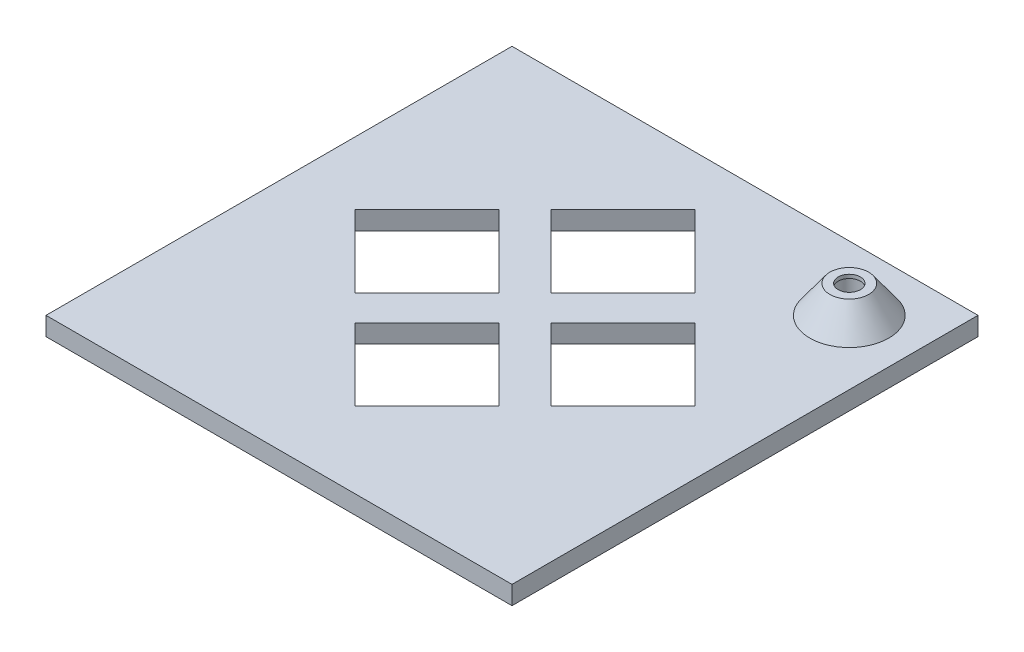
ISO-10303-21;
HEADER;
FILE_DESCRIPTION(('STEP AP214'),'2;1');
FILE_NAME('part.step','',(''),(''),'','','');
FILE_SCHEMA(('AUTOMOTIVE_DESIGN { 1 0 10303 214 1 1 1 1 }'));
ENDSEC;
DATA;
#1=APPLICATION_CONTEXT('core data for automotive mechanical design processes');
#2=APPLICATION_PROTOCOL_DEFINITION('international standard','automotive_design',2000,#1);
#3=PRODUCT_CONTEXT('',#1,'mechanical');
#4=PRODUCT('Part','Part','',(#3));
#5=PRODUCT_RELATED_PRODUCT_CATEGORY('part','',(#4));
#6=PRODUCT_DEFINITION_FORMATION('','',#4);
#7=PRODUCT_DEFINITION_CONTEXT('part definition',#1,'design');
#8=PRODUCT_DEFINITION('design','',#6,#7);
#9=PRODUCT_DEFINITION_SHAPE('','',#8);
#10=(LENGTH_UNIT() NAMED_UNIT(*) SI_UNIT(.MILLI.,.METRE.));
#11=(NAMED_UNIT(*) PLANE_ANGLE_UNIT() SI_UNIT($,.RADIAN.));
#12=(NAMED_UNIT(*) SI_UNIT($,.STERADIAN.) SOLID_ANGLE_UNIT());
#13=UNCERTAINTY_MEASURE_WITH_UNIT(LENGTH_MEASURE(1.E-05),#10,'distance_accuracy_value','');
#14=(GEOMETRIC_REPRESENTATION_CONTEXT(3) GLOBAL_UNCERTAINTY_ASSIGNED_CONTEXT((#13)) GLOBAL_UNIT_ASSIGNED_CONTEXT((#10,
#11,#12)) REPRESENTATION_CONTEXT('',''));
#15=CARTESIAN_POINT('',(0.,0.,0.));
#16=DIRECTION('',(0.,0.,1.));
#17=DIRECTION('',(1.,0.,0.));
#18=AXIS2_PLACEMENT_3D('',#15,#16,#17);
#19=CARTESIAN_POINT('',(0.,5.,0.));
#20=DIRECTION('',(1.,0.,0.));
#21=DIRECTION('',(0.,0.,-1.));
#22=AXIS2_PLACEMENT_3D('',#19,#20,#21);
#23=PLANE('',#22);
#24=DIRECTION('',(0.,0.,1.));
#25=VECTOR('',#24,1.);
#26=CARTESIAN_POINT('',(0.,0.,0.));
#27=LINE('',#26,#25);
#28=CARTESIAN_POINT('',(0.,0.,-126.));
#29=VERTEX_POINT('',#28);
#30=CARTESIAN_POINT('',(0.,0.,0.));
#31=VERTEX_POINT('',#30);
#32=EDGE_CURVE('E384',#29,#31,#27,.T.);
#33=ORIENTED_EDGE('',*,*,#32,.T.);
#34=DIRECTION('',(0.,-1.,0.));
#35=VECTOR('',#34,1.);
#36=CARTESIAN_POINT('',(0.,5.,0.));
#37=LINE('',#36,#35);
#38=CARTESIAN_POINT('',(0.,5.,0.));
#39=VERTEX_POINT('',#38);
#40=EDGE_CURVE('E426',#39,#31,#37,.T.);
#41=ORIENTED_EDGE('',*,*,#40,.F.);
#42=DIRECTION('',(0.,0.,1.));
#43=VECTOR('',#42,1.);
#44=CARTESIAN_POINT('',(0.,5.,0.));
#45=LINE('',#44,#43);
#46=CARTESIAN_POINT('',(0.,5.,-126.));
#47=VERTEX_POINT('',#46);
#48=EDGE_CURVE('E389',#47,#39,#45,.T.);
#49=ORIENTED_EDGE('',*,*,#48,.F.);
#50=DIRECTION('',(0.,-1.,0.));
#51=VECTOR('',#50,1.);
#52=CARTESIAN_POINT('',(0.,5.,-126.));
#53=LINE('',#52,#51);
#54=EDGE_CURVE('E403',#47,#29,#53,.T.);
#55=ORIENTED_EDGE('',*,*,#54,.T.);
#56=EDGE_LOOP('',(#33,#41,#49,#55));
#57=FACE_BOUND('',#56,.T.);
#58=ADVANCED_FACE('F40',(#57),#23,.F.);
#59=CARTESIAN_POINT('',(0.,5.,0.));
#60=DIRECTION('',(0.,0.,-1.));
#61=DIRECTION('',(-1.,0.,0.));
#62=AXIS2_PLACEMENT_3D('',#59,#60,#61);
#63=PLANE('',#62);
#64=DIRECTION('',(1.,0.,0.));
#65=VECTOR('',#64,1.);
#66=CARTESIAN_POINT('',(0.,0.,0.));
#67=LINE('',#66,#65);
#68=CARTESIAN_POINT('',(126.,0.,0.));
#69=VERTEX_POINT('',#68);
#70=EDGE_CURVE('E407',#31,#69,#67,.T.);
#71=ORIENTED_EDGE('',*,*,#70,.T.);
#72=DIRECTION('',(0.,-1.,0.));
#73=VECTOR('',#72,1.);
#74=CARTESIAN_POINT('',(126.,5.,0.));
#75=LINE('',#74,#73);
#76=CARTESIAN_POINT('',(126.,5.,0.));
#77=VERTEX_POINT('',#76);
#78=EDGE_CURVE('E422',#77,#69,#75,.T.);
#79=ORIENTED_EDGE('',*,*,#78,.F.);
#80=DIRECTION('',(1.,0.,0.));
#81=VECTOR('',#80,1.);
#82=CARTESIAN_POINT('',(0.,5.,0.));
#83=LINE('',#82,#81);
#84=EDGE_CURVE('E393',#39,#77,#83,.T.);
#85=ORIENTED_EDGE('',*,*,#84,.F.);
#86=ORIENTED_EDGE('',*,*,#40,.T.);
#87=EDGE_LOOP('',(#71,#79,#85,#86));
#88=FACE_BOUND('',#87,.T.);
#89=ADVANCED_FACE('F455',(#88),#63,.F.);
#90=CARTESIAN_POINT('',(126.,5.,0.));
#91=DIRECTION('',(-1.,0.,0.));
#92=DIRECTION('',(0.,0.,1.));
#93=AXIS2_PLACEMENT_3D('',#90,#91,#92);
#94=PLANE('',#93);
#95=DIRECTION('',(0.,0.,-1.));
#96=VECTOR('',#95,1.);
#97=CARTESIAN_POINT('',(126.,0.,0.));
#98=LINE('',#97,#96);
#99=CARTESIAN_POINT('',(126.,0.,-126.));
#100=VERTEX_POINT('',#99);
#101=EDGE_CURVE('E410',#69,#100,#98,.T.);
#102=ORIENTED_EDGE('',*,*,#101,.T.);
#103=DIRECTION('',(0.,-1.,0.));
#104=VECTOR('',#103,1.);
#105=CARTESIAN_POINT('',(126.,5.,-126.));
#106=LINE('',#105,#104);
#107=CARTESIAN_POINT('',(126.,5.,-126.));
#108=VERTEX_POINT('',#107);
#109=EDGE_CURVE('E418',#108,#100,#106,.T.);
#110=ORIENTED_EDGE('',*,*,#109,.F.);
#111=DIRECTION('',(0.,0.,-1.));
#112=VECTOR('',#111,1.);
#113=CARTESIAN_POINT('',(126.,5.,0.));
#114=LINE('',#113,#112);
#115=EDGE_CURVE('E397',#77,#108,#114,.T.);
#116=ORIENTED_EDGE('',*,*,#115,.F.);
#117=ORIENTED_EDGE('',*,*,#78,.T.);
#118=EDGE_LOOP('',(#102,#110,#116,#117));
#119=FACE_BOUND('',#118,.T.);
#120=ADVANCED_FACE('F460',(#119),#94,.F.);
#121=CARTESIAN_POINT('',(0.,5.,-126.));
#122=DIRECTION('',(0.,0.,1.));
#123=DIRECTION('',(1.,0.,0.));
#124=AXIS2_PLACEMENT_3D('',#121,#122,#123);
#125=PLANE('',#124);
#126=DIRECTION('',(-1.,0.,0.));
#127=VECTOR('',#126,1.);
#128=CARTESIAN_POINT('',(0.,0.,-126.));
#129=LINE('',#128,#127);
#130=EDGE_CURVE('E394',#100,#29,#129,.T.);
#131=ORIENTED_EDGE('',*,*,#130,.T.);
#132=ORIENTED_EDGE('',*,*,#54,.F.);
#133=DIRECTION('',(-1.,0.,0.));
#134=VECTOR('',#133,1.);
#135=CARTESIAN_POINT('',(0.,5.,-126.));
#136=LINE('',#135,#134);
#137=EDGE_CURVE('E400',#108,#47,#136,.T.);
#138=ORIENTED_EDGE('',*,*,#137,.F.);
#139=ORIENTED_EDGE('',*,*,#109,.T.);
#140=EDGE_LOOP('',(#131,#132,#138,#139));
#141=FACE_BOUND('',#140,.T.);
#142=ADVANCED_FACE('F466',(#141),#125,.F.);
#143=CARTESIAN_POINT('',(0.,5.,0.));
#144=DIRECTION('',(0.,-1.,0.));
#145=DIRECTION('',(0.,0.,-1.));
#146=AXIS2_PLACEMENT_3D('',#143,#144,#145);
#147=PLANE('',#146);
#148=DIRECTION('',(-0.707106781186548,0.,-0.707106781186547));
#149=VECTOR('',#148,1.);
#150=CARTESIAN_POINT('',(68.25,5.,-68.2500000000001));
#151=LINE('',#150,#149);
#152=CARTESIAN_POINT('',(63.,5.,-73.5000000000001));
#153=VERTEX_POINT('',#152);
#154=CARTESIAN_POINT('',(43.5,5.,-93.));
#155=VERTEX_POINT('',#154);
#156=EDGE_CURVE('E359',#153,#155,#151,.T.);
#157=ORIENTED_EDGE('',*,*,#156,.T.);
#158=DIRECTION('',(0.707106781186547,0.,-0.707106781186548));
#159=VECTOR('',#158,1.);
#160=CARTESIAN_POINT('',(-24.75,5.,-24.75));
#161=LINE('',#160,#159);
#162=CARTESIAN_POINT('',(63.,5.,-112.5));
#163=VERTEX_POINT('',#162);
#164=EDGE_CURVE('E371',#155,#163,#161,.T.);
#165=ORIENTED_EDGE('',*,*,#164,.T.);
#166=DIRECTION('',(0.707106781186547,0.,0.707106781186548));
#167=VECTOR('',#166,1.);
#168=CARTESIAN_POINT('',(87.7500000000001,5.,-87.7499999999999));
#169=LINE('',#168,#167);
#170=CARTESIAN_POINT('',(82.4999999999999,5.,-93.0000000000001));
#171=VERTEX_POINT('',#170);
#172=EDGE_CURVE('E367',#163,#171,#169,.T.);
#173=ORIENTED_EDGE('',*,*,#172,.T.);
#174=DIRECTION('',(-0.707106781186547,0.,0.707106781186548));
#175=VECTOR('',#174,1.);
#176=CARTESIAN_POINT('',(-5.24999999999998,5.,-5.24999999999997));
#177=LINE('',#176,#175);
#178=EDGE_CURVE('E363',#171,#153,#177,.T.);
#179=ORIENTED_EDGE('',*,*,#178,.T.);
#180=EDGE_LOOP('',(#157,#165,#173,#179));
#181=FACE_BOUND('',#180,.T.);
#182=DIRECTION('',(0.707106781186548,0.,0.707106781186548));
#183=VECTOR('',#182,1.);
#184=CARTESIAN_POINT('',(87.75,5.,-87.75));
#185=LINE('',#184,#183);
#186=CARTESIAN_POINT('',(89.5,5.,-86.0000000000001));
#187=VERTEX_POINT('',#186);
#188=CARTESIAN_POINT('',(109.,5.,-66.5000000000001));
#189=VERTEX_POINT('',#188);
#190=EDGE_CURVE('E343',#187,#189,#185,.T.);
#191=ORIENTED_EDGE('',*,*,#190,.T.);
#192=DIRECTION('',(-0.707106781186548,0.,0.707106781186547));
#193=VECTOR('',#192,1.);
#194=CARTESIAN_POINT('',(21.2499999999999,5.,21.2499999999999));
#195=LINE('',#194,#193);
#196=CARTESIAN_POINT('',(89.5,5.,-47.));
#197=VERTEX_POINT('',#196);
#198=EDGE_CURVE('E355',#189,#197,#195,.T.);
#199=ORIENTED_EDGE('',*,*,#198,.T.);
#200=DIRECTION('',(-0.707106781186547,0.,-0.707106781186548));
#201=VECTOR('',#200,1.);
#202=CARTESIAN_POINT('',(68.25,5.,-68.25));
#203=LINE('',#202,#201);
#204=CARTESIAN_POINT('',(70.,5.,-66.5000000000001));
#205=VERTEX_POINT('',#204);
#206=EDGE_CURVE('E351',#197,#205,#203,.T.);
#207=ORIENTED_EDGE('',*,*,#206,.T.);
#208=DIRECTION('',(0.707106781186548,0.,-0.707106781186548));
#209=VECTOR('',#208,1.);
#210=CARTESIAN_POINT('',(1.74999999999996,5.,1.74999999999996));
#211=LINE('',#210,#209);
#212=EDGE_CURVE('E347',#205,#187,#211,.T.);
#213=ORIENTED_EDGE('',*,*,#212,.T.);
#214=EDGE_LOOP('',(#191,#199,#207,#213));
#215=FACE_BOUND('',#214,.T.);
#216=DIRECTION('',(0.707106781186548,0.,0.707106781186547));
#217=VECTOR('',#216,1.);
#218=CARTESIAN_POINT('',(61.25,5.,-61.25));
#219=LINE('',#218,#217);
#220=CARTESIAN_POINT('',(36.4999999999999,5.,-86.0000000000001));
#221=VERTEX_POINT('',#220);
#222=CARTESIAN_POINT('',(55.9999999999999,5.,-66.5000000000001));
#223=VERTEX_POINT('',#222);
#224=EDGE_CURVE('E330',#221,#223,#219,.T.);
#225=ORIENTED_EDGE('',*,*,#224,.T.);
#226=DIRECTION('',(-0.707106781186547,0.,0.707106781186548));
#227=VECTOR('',#226,1.);
#228=CARTESIAN_POINT('',(-5.25000000000003,5.,-5.25000000000002));
#229=LINE('',#228,#227);
#230=CARTESIAN_POINT('',(36.5,5.,-47.0000000000001));
#231=VERTEX_POINT('',#230);
#232=EDGE_CURVE('E187',#223,#231,#229,.T.);
#233=ORIENTED_EDGE('',*,*,#232,.T.);
#234=DIRECTION('',(-0.707106781186548,0.,-0.707106781186547));
#235=VECTOR('',#234,1.);
#236=CARTESIAN_POINT('',(41.75,5.,-41.75));
#237=LINE('',#236,#235);
#238=CARTESIAN_POINT('',(16.9999999999999,5.,-66.5));
#239=VERTEX_POINT('',#238);
#240=EDGE_CURVE('E337',#231,#239,#237,.T.);
#241=ORIENTED_EDGE('',*,*,#240,.T.);
#242=DIRECTION('',(0.707106781186547,0.,-0.707106781186548));
#243=VECTOR('',#242,1.);
#244=CARTESIAN_POINT('',(-24.75,5.,-24.75));
#245=LINE('',#244,#243);
#246=EDGE_CURVE('E333',#239,#221,#245,.T.);
#247=ORIENTED_EDGE('',*,*,#246,.T.);
#248=EDGE_LOOP('',(#225,#233,#241,#247));
#249=FACE_BOUND('',#248,.T.);
#250=DIRECTION('',(0.707106781186548,0.,-0.707106781186548));
#251=VECTOR('',#250,1.);
#252=CARTESIAN_POINT('',(1.74999999999996,5.,1.74999999999996));
#253=LINE('',#252,#251);
#254=CARTESIAN_POINT('',(43.5,5.,-40.));
#255=VERTEX_POINT('',#254);
#256=CARTESIAN_POINT('',(63.,5.,-59.5));
#257=VERTEX_POINT('',#256);
#258=EDGE_CURVE('E304',#255,#257,#253,.T.);
#259=ORIENTED_EDGE('',*,*,#258,.T.);
#260=DIRECTION('',(0.707106781186548,0.,0.707106781186548));
#261=VECTOR('',#260,1.);
#262=CARTESIAN_POINT('',(61.25,5.,-61.25));
#263=LINE('',#262,#261);
#264=CARTESIAN_POINT('',(82.5,5.,-40.));
#265=VERTEX_POINT('',#264);
#266=EDGE_CURVE('E326',#257,#265,#263,.T.);
#267=ORIENTED_EDGE('',*,*,#266,.T.);
#268=DIRECTION('',(-0.707106781186548,0.,0.707106781186547));
#269=VECTOR('',#268,1.);
#270=CARTESIAN_POINT('',(21.25,5.,21.25));
#271=LINE('',#270,#269);
#272=CARTESIAN_POINT('',(63.,5.,-20.5));
#273=VERTEX_POINT('',#272);
#274=EDGE_CURVE('E322',#265,#273,#271,.T.);
#275=ORIENTED_EDGE('',*,*,#274,.T.);
#276=DIRECTION('',(-0.707106781186548,0.,-0.707106781186547));
#277=VECTOR('',#276,1.);
#278=CARTESIAN_POINT('',(41.75,5.,-41.75));
#279=LINE('',#278,#277);
#280=EDGE_CURVE('E318',#273,#255,#279,.T.);
#281=ORIENTED_EDGE('',*,*,#280,.T.);
#282=EDGE_LOOP('',(#259,#267,#275,#281));
#283=FACE_BOUND('',#282,.T.);
#284=CARTESIAN_POINT('',(108.6,5.,-108.6));
#285=DIRECTION('',(0.,-1.,0.));
#286=DIRECTION('',(0.,0.,-1.));
#287=AXIS2_PLACEMENT_3D('',#284,#285,#286);
#288=CIRCLE('',#287,10.6836436799865);
#289=CARTESIAN_POINT('',(108.6,5.,-119.283643679987));
#290=VERTEX_POINT('',#289);
#291=EDGE_CURVE('E11',#290,#290,#288,.T.);
#292=ORIENTED_EDGE('',*,*,#291,.T.);
#293=EDGE_LOOP('',(#292));
#294=FACE_BOUND('',#293,.T.);
#295=ORIENTED_EDGE('',*,*,#48,.T.);
#296=ORIENTED_EDGE('',*,*,#84,.T.);
#297=ORIENTED_EDGE('',*,*,#115,.T.);
#298=ORIENTED_EDGE('',*,*,#137,.T.);
#299=EDGE_LOOP('',(#295,#296,#297,#298));
#300=FACE_BOUND('',#299,.T.);
#301=ADVANCED_FACE('F470',(#181,#215,#249,#283,#294,#300),#147,.F.);
#302=CARTESIAN_POINT('',(0.,0.,0.));
#303=DIRECTION('',(0.,-1.,0.));
#304=DIRECTION('',(0.,0.,-1.));
#305=AXIS2_PLACEMENT_3D('',#302,#303,#304);
#306=PLANE('',#305);
#307=DIRECTION('',(-0.707106781186547,0.,0.707106781186548));
#308=VECTOR('',#307,1.);
#309=CARTESIAN_POINT('',(43.5,0.,-93.));
#310=LINE('',#309,#308);
#311=CARTESIAN_POINT('',(63.,0.,-112.5));
#312=VERTEX_POINT('',#311);
#313=CARTESIAN_POINT('',(43.5,0.,-93.));
#314=VERTEX_POINT('',#313);
#315=EDGE_CURVE('E217',#312,#314,#310,.T.);
#316=ORIENTED_EDGE('',*,*,#315,.T.);
#317=DIRECTION('',(0.707106781186548,0.,0.707106781186547));
#318=VECTOR('',#317,1.);
#319=CARTESIAN_POINT('',(63.,0.,-73.5000000000001));
#320=LINE('',#319,#318);
#321=CARTESIAN_POINT('',(63.,0.,-73.5000000000001));
#322=VERTEX_POINT('',#321);
#323=EDGE_CURVE('E227',#314,#322,#320,.T.);
#324=ORIENTED_EDGE('',*,*,#323,.T.);
#325=DIRECTION('',(0.707106781186547,0.,-0.707106781186548));
#326=VECTOR('',#325,1.);
#327=CARTESIAN_POINT('',(63.,0.,-73.5000000000001));
#328=LINE('',#327,#326);
#329=CARTESIAN_POINT('',(82.4999999999999,0.,-93.0000000000001));
#330=VERTEX_POINT('',#329);
#331=EDGE_CURVE('E231',#322,#330,#328,.T.);
#332=ORIENTED_EDGE('',*,*,#331,.T.);
#333=DIRECTION('',(-0.707106781186547,0.,-0.707106781186548));
#334=VECTOR('',#333,1.);
#335=CARTESIAN_POINT('',(82.4999999999999,0.,-93.0000000000001));
#336=LINE('',#335,#334);
#337=EDGE_CURVE('E235',#330,#312,#336,.T.);
#338=ORIENTED_EDGE('',*,*,#337,.T.);
#339=EDGE_LOOP('',(#316,#324,#332,#338));
#340=FACE_BOUND('',#339,.T.);
#341=DIRECTION('',(0.707106781186548,0.,-0.707106781186547));
#342=VECTOR('',#341,1.);
#343=CARTESIAN_POINT('',(89.5,0.,-47.));
#344=LINE('',#343,#342);
#345=CARTESIAN_POINT('',(89.5,0.,-47.));
#346=VERTEX_POINT('',#345);
#347=CARTESIAN_POINT('',(109.,0.,-66.5000000000001));
#348=VERTEX_POINT('',#347);
#349=EDGE_CURVE('E243',#346,#348,#344,.T.);
#350=ORIENTED_EDGE('',*,*,#349,.T.);
#351=DIRECTION('',(-0.707106781186548,0.,-0.707106781186548));
#352=VECTOR('',#351,1.);
#353=CARTESIAN_POINT('',(89.5,0.,-86.0000000000001));
#354=LINE('',#353,#352);
#355=CARTESIAN_POINT('',(89.5,0.,-86.0000000000001));
#356=VERTEX_POINT('',#355);
#357=EDGE_CURVE('E257',#348,#356,#354,.T.);
#358=ORIENTED_EDGE('',*,*,#357,.T.);
#359=DIRECTION('',(-0.707106781186548,0.,0.707106781186548));
#360=VECTOR('',#359,1.);
#361=CARTESIAN_POINT('',(70.,0.,-66.5000000000001));
#362=LINE('',#361,#360);
#363=CARTESIAN_POINT('',(70.,0.,-66.5000000000001));
#364=VERTEX_POINT('',#363);
#365=EDGE_CURVE('E261',#356,#364,#362,.T.);
#366=ORIENTED_EDGE('',*,*,#365,.T.);
#367=DIRECTION('',(0.707106781186547,0.,0.707106781186548));
#368=VECTOR('',#367,1.);
#369=CARTESIAN_POINT('',(70.,0.,-66.5000000000001));
#370=LINE('',#369,#368);
#371=EDGE_CURVE('E265',#364,#346,#370,.T.);
#372=ORIENTED_EDGE('',*,*,#371,.T.);
#373=EDGE_LOOP('',(#350,#358,#366,#372));
#374=FACE_BOUND('',#373,.T.);
#375=DIRECTION('',(0.707106781186547,0.,-0.707106781186548));
#376=VECTOR('',#375,1.);
#377=CARTESIAN_POINT('',(55.9999999999999,0.,-66.5000000000001));
#378=LINE('',#377,#376);
#379=CARTESIAN_POINT('',(36.5,0.,-47.0000000000001));
#380=VERTEX_POINT('',#379);
#381=CARTESIAN_POINT('',(55.9999999999999,0.,-66.5000000000001));
#382=VERTEX_POINT('',#381);
#383=EDGE_CURVE('E184',#380,#382,#378,.T.);
#384=ORIENTED_EDGE('',*,*,#383,.T.);
#385=DIRECTION('',(-0.707106781186548,0.,-0.707106781186547));
#386=VECTOR('',#385,1.);
#387=CARTESIAN_POINT('',(55.9999999999999,0.,-66.5000000000001));
#388=LINE('',#387,#386);
#389=CARTESIAN_POINT('',(36.4999999999999,0.,-86.));
#390=VERTEX_POINT('',#389);
#391=EDGE_CURVE('E196',#382,#390,#388,.T.);
#392=ORIENTED_EDGE('',*,*,#391,.T.);
#393=DIRECTION('',(-0.707106781186547,0.,0.707106781186548));
#394=VECTOR('',#393,1.);
#395=CARTESIAN_POINT('',(36.4999999999999,0.,-86.0000000000001));
#396=LINE('',#395,#394);
#397=CARTESIAN_POINT('',(16.9999999999999,0.,-66.5));
#398=VERTEX_POINT('',#397);
#399=EDGE_CURVE('E202',#390,#398,#396,.T.);
#400=ORIENTED_EDGE('',*,*,#399,.T.);
#401=DIRECTION('',(0.707106781186548,0.,0.707106781186547));
#402=VECTOR('',#401,1.);
#403=CARTESIAN_POINT('',(36.5,0.,-47.0000000000001));
#404=LINE('',#403,#402);
#405=EDGE_CURVE('E192',#398,#380,#404,.T.);
#406=ORIENTED_EDGE('',*,*,#405,.T.);
#407=EDGE_LOOP('',(#384,#392,#400,#406));
#408=FACE_BOUND('',#407,.T.);
#409=DIRECTION('',(-0.707106781186548,0.,-0.707106781186548));
#410=VECTOR('',#409,1.);
#411=CARTESIAN_POINT('',(63.,0.,-59.5));
#412=LINE('',#411,#410);
#413=CARTESIAN_POINT('',(82.5,0.,-40.));
#414=VERTEX_POINT('',#413);
#415=CARTESIAN_POINT('',(63.,0.,-59.5));
#416=VERTEX_POINT('',#415);
#417=EDGE_CURVE('E273',#414,#416,#412,.T.);
#418=ORIENTED_EDGE('',*,*,#417,.T.);
#419=DIRECTION('',(-0.707106781186548,0.,0.707106781186548));
#420=VECTOR('',#419,1.);
#421=CARTESIAN_POINT('',(63.,0.,-59.5));
#422=LINE('',#421,#420);
#423=CARTESIAN_POINT('',(43.5,0.,-40.));
#424=VERTEX_POINT('',#423);
#425=EDGE_CURVE('E287',#416,#424,#422,.T.);
#426=ORIENTED_EDGE('',*,*,#425,.T.);
#427=DIRECTION('',(0.707106781186548,0.,0.707106781186547));
#428=VECTOR('',#427,1.);
#429=CARTESIAN_POINT('',(43.5,0.,-40.));
#430=LINE('',#429,#428);
#431=CARTESIAN_POINT('',(63.,0.,-20.5));
#432=VERTEX_POINT('',#431);
#433=EDGE_CURVE('E291',#424,#432,#430,.T.);
#434=ORIENTED_EDGE('',*,*,#433,.T.);
#435=DIRECTION('',(0.707106781186548,0.,-0.707106781186547));
#436=VECTOR('',#435,1.);
#437=CARTESIAN_POINT('',(82.5,0.,-40.));
#438=LINE('',#437,#436);
#439=EDGE_CURVE('E295',#432,#414,#438,.T.);
#440=ORIENTED_EDGE('',*,*,#439,.T.);
#441=EDGE_LOOP('',(#418,#426,#434,#440));
#442=FACE_BOUND('',#441,.T.);
#443=CARTESIAN_POINT('',(108.6,0.,-108.6));
#444=DIRECTION('',(0.,-1.,0.));
#445=DIRECTION('',(0.,0.,-1.));
#446=AXIS2_PLACEMENT_3D('',#443,#444,#445);
#447=CIRCLE('',#446,3.44999999999999);
#448=CARTESIAN_POINT('',(108.6,0.,-112.05));
#449=VERTEX_POINT('',#448);
#450=EDGE_CURVE('E385',#449,#449,#447,.T.);
#451=ORIENTED_EDGE('',*,*,#450,.F.);
#452=EDGE_LOOP('',(#451));
#453=FACE_BOUND('',#452,.T.);
#454=ORIENTED_EDGE('',*,*,#32,.F.);
#455=ORIENTED_EDGE('',*,*,#130,.F.);
#456=ORIENTED_EDGE('',*,*,#101,.F.);
#457=ORIENTED_EDGE('',*,*,#70,.F.);
#458=EDGE_LOOP('',(#454,#455,#456,#457));
#459=FACE_BOUND('',#458,.T.);
#460=ADVANCED_FACE('F204',(#340,#374,#408,#442,#453,#459),#306,.T.);
#461=CARTESIAN_POINT('',(108.6,12.5,-108.6));
#462=DIRECTION('',(0.,1.,0.));
#463=DIRECTION('',(0.,0.,1.));
#464=AXIS2_PLACEMENT_3D('',#461,#462,#463);
#465=PLANE('',#464);
#466=CARTESIAN_POINT('',(108.6,12.5,-108.6));
#467=DIRECTION('',(0.,1.,0.));
#468=DIRECTION('',(0.,0.,1.));
#469=AXIS2_PLACEMENT_3D('',#466,#467,#468);
#470=CIRCLE('',#469,5.23457471994626);
#471=CARTESIAN_POINT('',(108.6,12.5,-113.834574719946));
#472=VERTEX_POINT('',#471);
#473=EDGE_CURVE('E50',#472,#472,#470,.T.);
#474=ORIENTED_EDGE('',*,*,#473,.T.);
#475=EDGE_LOOP('',(#474));
#476=FACE_BOUND('',#475,.T.);
#477=CARTESIAN_POINT('',(108.6,12.5,-108.6));
#478=DIRECTION('',(0.,1.,0.));
#479=DIRECTION('',(0.,0.,1.));
#480=AXIS2_PLACEMENT_3D('',#477,#478,#479);
#481=CIRCLE('',#480,3.00000000000001);
#482=CARTESIAN_POINT('',(108.6,12.5,-105.6));
#483=VERTEX_POINT('',#482);
#484=EDGE_CURVE('E375',#483,#483,#481,.T.);
#485=ORIENTED_EDGE('',*,*,#484,.F.);
#486=EDGE_LOOP('',(#485));
#487=FACE_BOUND('',#486,.T.);
#488=ADVANCED_FACE('F436',(#476,#487),#465,.T.);
#489=CARTESIAN_POINT('',(108.6,11.5,-108.6));
#490=DIRECTION('',(0.,-1.,0.));
#491=DIRECTION('',(0.,0.,-1.));
#492=AXIS2_PLACEMENT_3D('',#489,#490,#491);
#493=CYLINDRICAL_SURFACE('',#492,3.44999999999999);
#494=CARTESIAN_POINT('',(108.6,11.5,-108.6));
#495=DIRECTION('',(0.,-1.,0.));
#496=DIRECTION('',(0.,0.,-1.));
#497=AXIS2_PLACEMENT_3D('',#494,#495,#496);
#498=CIRCLE('',#497,3.44999999999999);
#499=CARTESIAN_POINT('',(108.6,11.5,-112.05));
#500=VERTEX_POINT('',#499);
#501=EDGE_CURVE('E380',#500,#500,#498,.T.);
#502=ORIENTED_EDGE('',*,*,#501,.F.);
#503=EDGE_LOOP('',(#502));
#504=FACE_BOUND('',#503,.T.);
#505=ORIENTED_EDGE('',*,*,#450,.T.);
#506=EDGE_LOOP('',(#505));
#507=FACE_BOUND('',#506,.T.);
#508=ADVANCED_FACE('F480',(#504,#507),#493,.F.);
#509=CARTESIAN_POINT('',(108.6,11.5,-108.6));
#510=DIRECTION('',(0.,-1.,0.));
#511=DIRECTION('',(0.,0.,-1.));
#512=AXIS2_PLACEMENT_3D('',#509,#510,#511);
#513=PLANE('',#512);
#514=CARTESIAN_POINT('',(108.6,11.5,-108.6));
#515=DIRECTION('',(0.,-1.,0.));
#516=DIRECTION('',(0.,0.,-1.));
#517=AXIS2_PLACEMENT_3D('',#514,#515,#516);
#518=CIRCLE('',#517,3.00000000000001);
#519=CARTESIAN_POINT('',(108.6,11.5,-111.6));
#520=VERTEX_POINT('',#519);
#521=EDGE_CURVE('E379',#520,#520,#518,.T.);
#522=ORIENTED_EDGE('',*,*,#521,.F.);
#523=EDGE_LOOP('',(#522));
#524=FACE_BOUND('',#523,.T.);
#525=ORIENTED_EDGE('',*,*,#501,.T.);
#526=EDGE_LOOP('',(#525));
#527=FACE_BOUND('',#526,.T.);
#528=ADVANCED_FACE('F450',(#524,#527),#513,.T.);
#529=CARTESIAN_POINT('',(108.6,0.,-108.6));
#530=DIRECTION('',(0.,1.,0.));
#531=DIRECTION('',(0.,0.,1.));
#532=AXIS2_PLACEMENT_3D('',#529,#530,#531);
#533=CYLINDRICAL_SURFACE('',#532,3.00000000000001);
#534=ORIENTED_EDGE('',*,*,#521,.T.);
#535=EDGE_LOOP('',(#534));
#536=FACE_BOUND('',#535,.T.);
#537=ORIENTED_EDGE('',*,*,#484,.T.);
#538=EDGE_LOOP('',(#537));
#539=FACE_BOUND('',#538,.T.);
#540=ADVANCED_FACE('F441',(#536,#539),#533,.F.);
#541=CARTESIAN_POINT('',(108.6,12.5,-108.6));
#542=DIRECTION('',(0.,-1.,0.));
#543=DIRECTION('',(0.,0.,-1.));
#544=AXIS2_PLACEMENT_3D('',#541,#542,#543);
#545=CONICAL_SURFACE('',#544,5.23457471994626,0.628318530717965);
#546=CARTESIAN_POINT('',(108.6,5.,-119.283643679987));
#547=CARTESIAN_POINT('',(108.6,5.078125,-119.226882544986));
#548=CARTESIAN_POINT('',(108.6,5.15625,-119.170121409986));
#549=CARTESIAN_POINT('',(108.6,5.3125,-119.056599139985));
#550=CARTESIAN_POINT('',(108.6,5.390625,-118.999838004984));
#551=CARTESIAN_POINT('',(108.6,5.546875,-118.886315734984));
#552=CARTESIAN_POINT('',(108.6,5.625,-118.829554599983));
#553=CARTESIAN_POINT('',(108.6,5.78125,-118.716032329982));
#554=CARTESIAN_POINT('',(108.6,5.859375,-118.659271194982));
#555=CARTESIAN_POINT('',(108.6,6.015625,-118.545748924981));
#556=CARTESIAN_POINT('',(108.6,6.09375,-118.488987789981));
#557=CARTESIAN_POINT('',(108.6,6.25,-118.37546551998));
#558=CARTESIAN_POINT('',(108.6,6.328125,-118.318704384979));
#559=CARTESIAN_POINT('',(108.6,6.484375,-118.205182114979));
#560=CARTESIAN_POINT('',(108.6,6.5625,-118.148420979978));
#561=CARTESIAN_POINT('',(108.6,6.71875,-118.034898709977));
#562=CARTESIAN_POINT('',(108.6,6.796875,-117.978137574977));
#563=CARTESIAN_POINT('',(108.6,6.953125,-117.864615304976));
#564=CARTESIAN_POINT('',(108.6,7.03125,-117.807854169976));
#565=CARTESIAN_POINT('',(108.6,7.1875,-117.694331899975));
#566=CARTESIAN_POINT('',(108.6,7.265625,-117.637570764974));
#567=CARTESIAN_POINT('',(108.6,7.421875,-117.524048494974));
#568=CARTESIAN_POINT('',(108.6,7.5,-117.467287359973));
#569=CARTESIAN_POINT('',(108.6,7.65625,-117.353765089972));
#570=CARTESIAN_POINT('',(108.6,7.734375,-117.297003954972));
#571=CARTESIAN_POINT('',(108.6,7.890625,-117.183481684971));
#572=CARTESIAN_POINT('',(108.6,7.96875,-117.126720549971));
#573=CARTESIAN_POINT('',(108.6,8.125,-117.01319827997));
#574=CARTESIAN_POINT('',(108.6,8.203125,-116.956437144969));
#575=CARTESIAN_POINT('',(108.6,8.359375,-116.842914874968));
#576=CARTESIAN_POINT('',(108.6,8.4375,-116.786153739968));
#577=CARTESIAN_POINT('',(108.6,8.59375,-116.672631469967));
#578=CARTESIAN_POINT('',(108.6,8.671875,-116.615870334967));
#579=CARTESIAN_POINT('',(108.6,8.828125,-116.502348064966));
#580=CARTESIAN_POINT('',(108.6,8.90625,-116.445586929966));
#581=CARTESIAN_POINT('',(108.6,9.0625,-116.332064659965));
#582=CARTESIAN_POINT('',(108.6,9.140625,-116.275303524964));
#583=CARTESIAN_POINT('',(108.6,9.296875,-116.161781254963));
#584=CARTESIAN_POINT('',(108.6,9.375,-116.105020119963));
#585=CARTESIAN_POINT('',(108.6,9.53125,-115.991497849962));
#586=CARTESIAN_POINT('',(108.6,9.609375,-115.934736714962));
#587=CARTESIAN_POINT('',(108.6,9.765625,-115.821214444961));
#588=CARTESIAN_POINT('',(108.6,9.84375,-115.764453309961));
#589=CARTESIAN_POINT('',(108.6,10.,-115.65093103996));
#590=CARTESIAN_POINT('',(108.6,10.078125,-115.594169904959));
#591=CARTESIAN_POINT('',(108.6,10.234375,-115.480647634958));
#592=CARTESIAN_POINT('',(108.6,10.3125,-115.423886499958));
#593=CARTESIAN_POINT('',(108.6,10.46875,-115.310364229957));
#594=CARTESIAN_POINT('',(108.6,10.546875,-115.253603094957));
#595=CARTESIAN_POINT('',(108.6,10.703125,-115.140080824956));
#596=CARTESIAN_POINT('',(108.6,10.78125,-115.083319689955));
#597=CARTESIAN_POINT('',(108.6,10.9375,-114.969797419955));
#598=CARTESIAN_POINT('',(108.6,11.015625,-114.913036284954));
#599=CARTESIAN_POINT('',(108.6,11.171875,-114.799514014953));
#600=CARTESIAN_POINT('',(108.6,11.25,-114.742752879953));
#601=CARTESIAN_POINT('',(108.6,11.40625,-114.629230609952));
#602=CARTESIAN_POINT('',(108.6,11.484375,-114.572469474952));
#603=CARTESIAN_POINT('',(108.6,11.640625,-114.458947204951));
#604=CARTESIAN_POINT('',(108.6,11.71875,-114.40218606995));
#605=CARTESIAN_POINT('',(108.6,11.875,-114.28866379995));
#606=CARTESIAN_POINT('',(108.6,11.953125,-114.231902664949));
#607=CARTESIAN_POINT('',(108.6,12.109375,-114.118380394948));
#608=CARTESIAN_POINT('',(108.6,12.1875,-114.061619259948));
#609=CARTESIAN_POINT('',(108.6,12.34375,-113.948096989947));
#610=CARTESIAN_POINT('',(108.6,12.421875,-113.891335854947));
#611=CARTESIAN_POINT('',(108.6,12.5,-113.834574719946));
#612=B_SPLINE_CURVE_WITH_KNOTS('',3,(#546,#547,#548,#549,#550,#551,#552,#553,#554,#555,#556,
#557,#558,#559,#560,#561,#562,#563,#564,#565,#566,#567,#568,#569,#570,#571,#572,#573,#574,#575,
#576,#577,#578,#579,#580,#581,#582,#583,#584,#585,#586,#587,#588,#589,#590,#591,#592,#593,#594,
#595,#596,#597,#598,#599,#600,#601,#602,#603,#604,#605,#606,#607,#608,#609,#610,#611),
.UNSPECIFIED.,.F.,.F.,(4,2,2,2,2,2,2,2,2,2,2,2,2,2,2,2,2,2,2,2,2,2,2,2,2,2,2,2,2,2,2,2,4),(0.,
0.289703432226508,0.579406864453025,0.869110296679541,1.15881372890605,1.44851716113257,
1.73822059335908,2.0279240255856,2.31762745781211,2.60733089003862,2.89703432226514,
3.18673775449166,3.47644118671817,3.76614461894468,4.0558480511712,4.34555148339771,
4.63525491562423,4.92495834785074,5.21466178007725,5.50436521230377,5.79406864453029,
6.0837720767568,6.37347550898331,6.66317894120983,6.95288237343634,7.24258580566286,
7.53228923788937,7.82199267011588,8.1116961023424,8.40139953456892,8.69110296679543,
8.98080639902195,9.27050983124846),.UNSPECIFIED.);
#613=EDGE_CURVE('BSEAM43',#290,#472,#612,.T.);
#614=ORIENTED_EDGE('',*,*,#291,.F.);
#615=ORIENTED_EDGE('',*,*,#473,.F.);
#616=ORIENTED_EDGE('',*,*,#613,.T.);
#617=ORIENTED_EDGE('',*,*,#613,.F.);
#618=EDGE_LOOP('',(#614,#616,#615,#617));
#619=FACE_BOUND('',#618,.T.);
#620=ADVANCED_FACE('F43',(#619),#545,.T.);
#621=CARTESIAN_POINT('',(63.,0.,-59.5));
#622=DIRECTION('',(0.707106781186548,0.,-0.707106781186548));
#623=DIRECTION('',(-0.707106781186548,0.,-0.707106781186548));
#624=AXIS2_PLACEMENT_3D('',#621,#622,#623);
#625=PLANE('',#624);
#626=DIRECTION('',(0.,1.,0.));
#627=VECTOR('',#626,1.);
#628=CARTESIAN_POINT('',(63.,0.,-59.5));
#629=LINE('',#628,#627);
#630=EDGE_CURVE('E299',#416,#257,#629,.T.);
#631=ORIENTED_EDGE('',*,*,#630,.F.);
#632=ORIENTED_EDGE('',*,*,#417,.F.);
#633=DIRECTION('',(0.,1.,0.));
#634=VECTOR('',#633,1.);
#635=CARTESIAN_POINT('',(82.5,0.,-40.));
#636=LINE('',#635,#634);
#637=EDGE_CURVE('E300',#414,#265,#636,.T.);
#638=ORIENTED_EDGE('',*,*,#637,.T.);
#639=ORIENTED_EDGE('',*,*,#266,.F.);
#640=EDGE_LOOP('',(#631,#632,#638,#639));
#641=FACE_BOUND('',#640,.T.);
#642=ADVANCED_FACE('F440',(#641),#625,.F.);
#643=CARTESIAN_POINT('',(82.5,0.,-40.));
#644=DIRECTION('',(0.707106781186547,0.,0.707106781186548));
#645=DIRECTION('',(0.707106781186548,0.,-0.707106781186547));
#646=AXIS2_PLACEMENT_3D('',#643,#644,#645);
#647=PLANE('',#646);
#648=ORIENTED_EDGE('',*,*,#637,.F.);
#649=ORIENTED_EDGE('',*,*,#439,.F.);
#650=DIRECTION('',(0.,1.,0.));
#651=VECTOR('',#650,1.);
#652=CARTESIAN_POINT('',(63.,0.,-20.5));
#653=LINE('',#652,#651);
#654=EDGE_CURVE('E305',#432,#273,#653,.T.);
#655=ORIENTED_EDGE('',*,*,#654,.T.);
#656=ORIENTED_EDGE('',*,*,#274,.F.);
#657=EDGE_LOOP('',(#648,#649,#655,#656));
#658=FACE_BOUND('',#657,.T.);
#659=ADVANCED_FACE('F447',(#658),#647,.F.);
#660=CARTESIAN_POINT('',(43.5,0.,-40.));
#661=DIRECTION('',(-0.707106781186547,0.,0.707106781186548));
#662=DIRECTION('',(0.707106781186548,0.,0.707106781186547));
#663=AXIS2_PLACEMENT_3D('',#660,#661,#662);
#664=PLANE('',#663);
#665=ORIENTED_EDGE('',*,*,#654,.F.);
#666=ORIENTED_EDGE('',*,*,#433,.F.);
#667=DIRECTION('',(0.,1.,0.));
#668=VECTOR('',#667,1.);
#669=CARTESIAN_POINT('',(43.5,0.,-40.));
#670=LINE('',#669,#668);
#671=EDGE_CURVE('E309',#424,#255,#670,.T.);
#672=ORIENTED_EDGE('',*,*,#671,.T.);
#673=ORIENTED_EDGE('',*,*,#280,.F.);
#674=EDGE_LOOP('',(#665,#666,#672,#673));
#675=FACE_BOUND('',#674,.T.);
#676=ADVANCED_FACE('F490',(#675),#664,.F.);
#677=CARTESIAN_POINT('',(63.,0.,-59.5));
#678=DIRECTION('',(-0.707106781186548,0.,-0.707106781186548));
#679=DIRECTION('',(-0.707106781186548,0.,0.707106781186548));
#680=AXIS2_PLACEMENT_3D('',#677,#678,#679);
#681=PLANE('',#680);
#682=ORIENTED_EDGE('',*,*,#671,.F.);
#683=ORIENTED_EDGE('',*,*,#425,.F.);
#684=ORIENTED_EDGE('',*,*,#630,.T.);
#685=ORIENTED_EDGE('',*,*,#258,.F.);
#686=EDGE_LOOP('',(#682,#683,#684,#685));
#687=FACE_BOUND('',#686,.T.);
#688=ADVANCED_FACE('F487',(#687),#681,.F.);
#689=CARTESIAN_POINT('',(55.9999999999999,0.,-66.5000000000001));
#690=DIRECTION('',(0.707106781186548,0.,0.707106781186547));
#691=DIRECTION('',(0.707106781186547,0.,-0.707106781186548));
#692=AXIS2_PLACEMENT_3D('',#689,#690,#691);
#693=PLANE('',#692);
#694=DIRECTION('',(0.,1.,0.));
#695=VECTOR('',#694,1.);
#696=CARTESIAN_POINT('',(55.9999999999999,0.,-66.5000000000001));
#697=LINE('',#696,#695);
#698=EDGE_CURVE('E179',#382,#223,#697,.T.);
#699=ORIENTED_EDGE('',*,*,#698,.F.);
#700=ORIENTED_EDGE('',*,*,#383,.F.);
#701=DIRECTION('',(0.,1.,0.));
#702=VECTOR('',#701,1.);
#703=CARTESIAN_POINT('',(36.5,0.,-47.0000000000001));
#704=LINE('',#703,#702);
#705=EDGE_CURVE('E214',#380,#231,#704,.T.);
#706=ORIENTED_EDGE('',*,*,#705,.T.);
#707=ORIENTED_EDGE('',*,*,#232,.F.);
#708=EDGE_LOOP('',(#699,#700,#706,#707));
#709=FACE_BOUND('',#708,.T.);
#710=ADVANCED_FACE('F181',(#709),#693,.F.);
#711=CARTESIAN_POINT('',(36.5,0.,-47.0000000000001));
#712=DIRECTION('',(-0.707106781186547,0.,0.707106781186548));
#713=DIRECTION('',(0.707106781186548,0.,0.707106781186547));
#714=AXIS2_PLACEMENT_3D('',#711,#712,#713);
#715=PLANE('',#714);
#716=ORIENTED_EDGE('',*,*,#705,.F.);
#717=ORIENTED_EDGE('',*,*,#405,.F.);
#718=DIRECTION('',(0.,1.,0.));
#719=VECTOR('',#718,1.);
#720=CARTESIAN_POINT('',(16.9999999999999,0.,-66.5));
#721=LINE('',#720,#719);
#722=EDGE_CURVE('E218',#398,#239,#721,.T.);
#723=ORIENTED_EDGE('',*,*,#722,.T.);
#724=ORIENTED_EDGE('',*,*,#240,.F.);
#725=EDGE_LOOP('',(#716,#717,#723,#724));
#726=FACE_BOUND('',#725,.T.);
#727=ADVANCED_FACE('F530',(#726),#715,.F.);
#728=CARTESIAN_POINT('',(36.4999999999999,0.,-86.0000000000001));
#729=DIRECTION('',(-0.707106781186548,0.,-0.707106781186547));
#730=DIRECTION('',(-0.707106781186547,0.,0.707106781186548));
#731=AXIS2_PLACEMENT_3D('',#728,#729,#730);
#732=PLANE('',#731);
#733=ORIENTED_EDGE('',*,*,#722,.F.);
#734=ORIENTED_EDGE('',*,*,#399,.F.);
#735=DIRECTION('',(0.,1.,0.));
#736=VECTOR('',#735,1.);
#737=CARTESIAN_POINT('',(36.4999999999999,0.,-86.0000000000001));
#738=LINE('',#737,#736);
#739=EDGE_CURVE('E191',#390,#221,#738,.T.);
#740=ORIENTED_EDGE('',*,*,#739,.T.);
#741=ORIENTED_EDGE('',*,*,#246,.F.);
#742=EDGE_LOOP('',(#733,#734,#740,#741));
#743=FACE_BOUND('',#742,.T.);
#744=ADVANCED_FACE('F533',(#743),#732,.F.);
#745=CARTESIAN_POINT('',(55.9999999999999,0.,-66.5000000000001));
#746=DIRECTION('',(0.707106781186547,0.,-0.707106781186548));
#747=DIRECTION('',(-0.707106781186548,0.,-0.707106781186547));
#748=AXIS2_PLACEMENT_3D('',#745,#746,#747);
#749=PLANE('',#748);
#750=ORIENTED_EDGE('',*,*,#739,.F.);
#751=ORIENTED_EDGE('',*,*,#391,.F.);
#752=ORIENTED_EDGE('',*,*,#698,.T.);
#753=ORIENTED_EDGE('',*,*,#224,.F.);
#754=EDGE_LOOP('',(#750,#751,#752,#753));
#755=FACE_BOUND('',#754,.T.);
#756=ADVANCED_FACE('F197',(#755),#749,.F.);
#757=CARTESIAN_POINT('',(89.5,0.,-47.));
#758=DIRECTION('',(0.707106781186547,0.,0.707106781186548));
#759=DIRECTION('',(0.707106781186548,0.,-0.707106781186547));
#760=AXIS2_PLACEMENT_3D('',#757,#758,#759);
#761=PLANE('',#760);
#762=DIRECTION('',(0.,1.,0.));
#763=VECTOR('',#762,1.);
#764=CARTESIAN_POINT('',(109.,0.,-66.5000000000001));
#765=LINE('',#764,#763);
#766=EDGE_CURVE('E65',#348,#189,#765,.T.);
#767=ORIENTED_EDGE('',*,*,#766,.F.);
#768=ORIENTED_EDGE('',*,*,#349,.F.);
#769=DIRECTION('',(0.,1.,0.));
#770=VECTOR('',#769,1.);
#771=CARTESIAN_POINT('',(89.5,0.,-47.));
#772=LINE('',#771,#770);
#773=EDGE_CURVE('E269',#346,#197,#772,.T.);
#774=ORIENTED_EDGE('',*,*,#773,.T.);
#775=ORIENTED_EDGE('',*,*,#198,.F.);
#776=EDGE_LOOP('',(#767,#768,#774,#775));
#777=FACE_BOUND('',#776,.T.);
#778=ADVANCED_FACE('F498',(#777),#761,.F.);
#779=CARTESIAN_POINT('',(70.,0.,-66.5000000000001));
#780=DIRECTION('',(-0.707106781186548,0.,0.707106781186547));
#781=DIRECTION('',(0.707106781186547,0.,0.707106781186548));
#782=AXIS2_PLACEMENT_3D('',#779,#780,#781);
#783=PLANE('',#782);
#784=ORIENTED_EDGE('',*,*,#773,.F.);
#785=ORIENTED_EDGE('',*,*,#371,.F.);
#786=DIRECTION('',(0.,1.,0.));
#787=VECTOR('',#786,1.);
#788=CARTESIAN_POINT('',(70.,0.,-66.5000000000001));
#789=LINE('',#788,#787);
#790=EDGE_CURVE('E274',#364,#205,#789,.T.);
#791=ORIENTED_EDGE('',*,*,#790,.T.);
#792=ORIENTED_EDGE('',*,*,#206,.F.);
#793=EDGE_LOOP('',(#784,#785,#791,#792));
#794=FACE_BOUND('',#793,.T.);
#795=ADVANCED_FACE('F501',(#794),#783,.F.);
#796=CARTESIAN_POINT('',(70.,0.,-66.5000000000001));
#797=DIRECTION('',(-0.707106781186548,0.,-0.707106781186548));
#798=DIRECTION('',(-0.707106781186548,0.,0.707106781186548));
#799=AXIS2_PLACEMENT_3D('',#796,#797,#798);
#800=PLANE('',#799);
#801=ORIENTED_EDGE('',*,*,#790,.F.);
#802=ORIENTED_EDGE('',*,*,#365,.F.);
#803=DIRECTION('',(0.,1.,0.));
#804=VECTOR('',#803,1.);
#805=CARTESIAN_POINT('',(89.5,0.,-86.0000000000001));
#806=LINE('',#805,#804);
#807=EDGE_CURVE('E278',#356,#187,#806,.T.);
#808=ORIENTED_EDGE('',*,*,#807,.T.);
#809=ORIENTED_EDGE('',*,*,#212,.F.);
#810=EDGE_LOOP('',(#801,#802,#808,#809));
#811=FACE_BOUND('',#810,.T.);
#812=ADVANCED_FACE('F507',(#811),#800,.F.);
#813=CARTESIAN_POINT('',(89.5,0.,-86.0000000000001));
#814=DIRECTION('',(0.707106781186548,0.,-0.707106781186548));
#815=DIRECTION('',(-0.707106781186548,0.,-0.707106781186548));
#816=AXIS2_PLACEMENT_3D('',#813,#814,#815);
#817=PLANE('',#816);
#818=ORIENTED_EDGE('',*,*,#807,.F.);
#819=ORIENTED_EDGE('',*,*,#357,.F.);
#820=ORIENTED_EDGE('',*,*,#766,.T.);
#821=ORIENTED_EDGE('',*,*,#190,.F.);
#822=EDGE_LOOP('',(#818,#819,#820,#821));
#823=FACE_BOUND('',#822,.T.);
#824=ADVANCED_FACE('F503',(#823),#817,.F.);
#825=CARTESIAN_POINT('',(43.5,0.,-93.));
#826=DIRECTION('',(-0.707106781186548,0.,-0.707106781186547));
#827=DIRECTION('',(-0.707106781186547,0.,0.707106781186548));
#828=AXIS2_PLACEMENT_3D('',#825,#826,#827);
#829=PLANE('',#828);
#830=DIRECTION('',(0.,1.,0.));
#831=VECTOR('',#830,1.);
#832=CARTESIAN_POINT('',(43.5,0.,-93.));
#833=LINE('',#832,#831);
#834=EDGE_CURVE('E57',#314,#155,#833,.T.);
#835=ORIENTED_EDGE('',*,*,#834,.F.);
#836=ORIENTED_EDGE('',*,*,#315,.F.);
#837=DIRECTION('',(0.,1.,0.));
#838=VECTOR('',#837,1.);
#839=CARTESIAN_POINT('',(63.,0.,-112.5));
#840=LINE('',#839,#838);
#841=EDGE_CURVE('E239',#312,#163,#840,.T.);
#842=ORIENTED_EDGE('',*,*,#841,.T.);
#843=ORIENTED_EDGE('',*,*,#164,.F.);
#844=EDGE_LOOP('',(#835,#836,#842,#843));
#845=FACE_BOUND('',#844,.T.);
#846=ADVANCED_FACE('F506',(#845),#829,.F.);
#847=CARTESIAN_POINT('',(82.4999999999999,0.,-93.0000000000001));
#848=DIRECTION('',(0.707106781186548,0.,-0.707106781186547));
#849=DIRECTION('',(-0.707106781186547,0.,-0.707106781186548));
#850=AXIS2_PLACEMENT_3D('',#847,#848,#849);
#851=PLANE('',#850);
#852=ORIENTED_EDGE('',*,*,#841,.F.);
#853=ORIENTED_EDGE('',*,*,#337,.F.);
#854=DIRECTION('',(0.,1.,0.));
#855=VECTOR('',#854,1.);
#856=CARTESIAN_POINT('',(82.4999999999999,0.,-93.0000000000001));
#857=LINE('',#856,#855);
#858=EDGE_CURVE('E244',#330,#171,#857,.T.);
#859=ORIENTED_EDGE('',*,*,#858,.T.);
#860=ORIENTED_EDGE('',*,*,#172,.F.);
#861=EDGE_LOOP('',(#852,#853,#859,#860));
#862=FACE_BOUND('',#861,.T.);
#863=ADVANCED_FACE('F516',(#862),#851,.F.);
#864=CARTESIAN_POINT('',(63.,0.,-73.5000000000001));
#865=DIRECTION('',(0.707106781186548,0.,0.707106781186547));
#866=DIRECTION('',(0.707106781186547,0.,-0.707106781186548));
#867=AXIS2_PLACEMENT_3D('',#864,#865,#866);
#868=PLANE('',#867);
#869=ORIENTED_EDGE('',*,*,#858,.F.);
#870=ORIENTED_EDGE('',*,*,#331,.F.);
#871=DIRECTION('',(0.,1.,0.));
#872=VECTOR('',#871,1.);
#873=CARTESIAN_POINT('',(63.,0.,-73.5000000000001));
#874=LINE('',#873,#872);
#875=EDGE_CURVE('E248',#322,#153,#874,.T.);
#876=ORIENTED_EDGE('',*,*,#875,.T.);
#877=ORIENTED_EDGE('',*,*,#178,.F.);
#878=EDGE_LOOP('',(#869,#870,#876,#877));
#879=FACE_BOUND('',#878,.T.);
#880=ADVANCED_FACE('F521',(#879),#868,.F.);
#881=CARTESIAN_POINT('',(63.,0.,-73.5000000000001));
#882=DIRECTION('',(-0.707106781186547,0.,0.707106781186548));
#883=DIRECTION('',(0.707106781186548,0.,0.707106781186547));
#884=AXIS2_PLACEMENT_3D('',#881,#882,#883);
#885=PLANE('',#884);
#886=ORIENTED_EDGE('',*,*,#875,.F.);
#887=ORIENTED_EDGE('',*,*,#323,.F.);
#888=ORIENTED_EDGE('',*,*,#834,.T.);
#889=ORIENTED_EDGE('',*,*,#156,.F.);
#890=EDGE_LOOP('',(#886,#887,#888,#889));
#891=FACE_BOUND('',#890,.T.);
#892=ADVANCED_FACE('F518',(#891),#885,.F.);
#893=CLOSED_SHELL('',(#58,#89,#120,#142,#301,#460,#488,#508,#528,#540,#620,#642,#659,#676,#688,
#710,#727,#744,#756,#778,#795,#812,#824,#846,#863,#880,#892));
#894=MANIFOLD_SOLID_BREP('B2',#893);
#895=ADVANCED_BREP_SHAPE_REPRESENTATION('',(#18,#894),#14);
#896=SHAPE_DEFINITION_REPRESENTATION(#9,#895);
ENDSEC;
END-ISO-10303-21;
